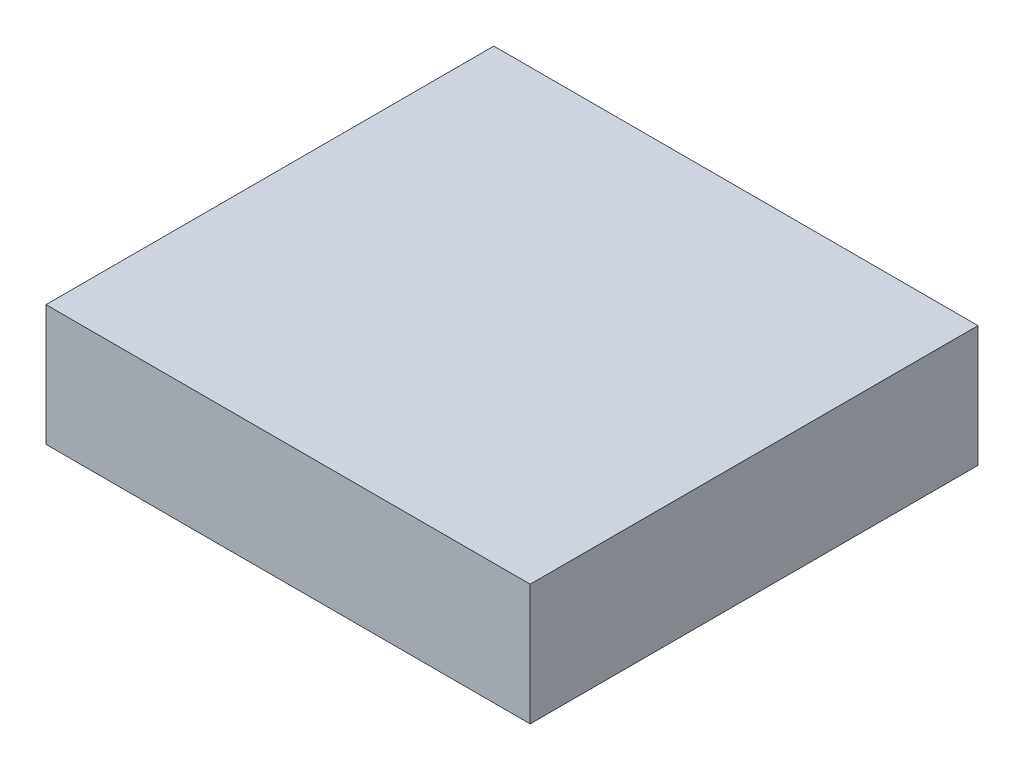
ISO-10303-21;
HEADER;
FILE_DESCRIPTION(('STEP AP214'),'2;1');
FILE_NAME('part.step','',(''),(''),'','','');
FILE_SCHEMA(('AUTOMOTIVE_DESIGN { 1 0 10303 214 1 1 1 1 }'));
ENDSEC;
DATA;
#1=APPLICATION_CONTEXT('core data for automotive mechanical design processes');
#2=APPLICATION_PROTOCOL_DEFINITION('international standard','automotive_design',2000,#1);
#3=PRODUCT_CONTEXT('',#1,'mechanical');
#4=PRODUCT('Part','Part','',(#3));
#5=PRODUCT_RELATED_PRODUCT_CATEGORY('part','',(#4));
#6=PRODUCT_DEFINITION_FORMATION('','',#4);
#7=PRODUCT_DEFINITION_CONTEXT('part definition',#1,'design');
#8=PRODUCT_DEFINITION('design','',#6,#7);
#9=PRODUCT_DEFINITION_SHAPE('','',#8);
#10=(LENGTH_UNIT() NAMED_UNIT(*) SI_UNIT(.MILLI.,.METRE.));
#11=(NAMED_UNIT(*) PLANE_ANGLE_UNIT() SI_UNIT($,.RADIAN.));
#12=(NAMED_UNIT(*) SI_UNIT($,.STERADIAN.) SOLID_ANGLE_UNIT());
#13=UNCERTAINTY_MEASURE_WITH_UNIT(LENGTH_MEASURE(1.E-05),#10,'distance_accuracy_value','');
#14=(GEOMETRIC_REPRESENTATION_CONTEXT(3) GLOBAL_UNCERTAINTY_ASSIGNED_CONTEXT((#13)) GLOBAL_UNIT_ASSIGNED_CONTEXT((#10,
#11,#12)) REPRESENTATION_CONTEXT('',''));
#15=CARTESIAN_POINT('',(0.,0.,0.));
#16=DIRECTION('',(0.,0.,1.));
#17=DIRECTION('',(1.,0.,0.));
#18=AXIS2_PLACEMENT_3D('',#15,#16,#17);
#19=CARTESIAN_POINT('',(0.,-10.,0.));
#20=DIRECTION('',(-1.,0.,0.));
#21=DIRECTION('',(0.,0.,1.));
#22=AXIS2_PLACEMENT_3D('',#19,#20,#21);
#23=PLANE('',#22);
#24=DIRECTION('',(0.,0.,1.));
#25=VECTOR('',#24,1.);
#26=CARTESIAN_POINT('',(0.,0.,0.));
#27=LINE('',#26,#25);
#28=CARTESIAN_POINT('',(0.,0.,-37.));
#29=VERTEX_POINT('',#28);
#30=CARTESIAN_POINT('',(0.,0.,0.));
#31=VERTEX_POINT('',#30);
#32=EDGE_CURVE('E104',#29,#31,#27,.T.);
#33=ORIENTED_EDGE('',*,*,#32,.F.);
#34=DIRECTION('',(0.,1.,0.));
#35=VECTOR('',#34,1.);
#36=CARTESIAN_POINT('',(0.,-10.,-37.));
#37=LINE('',#36,#35);
#38=CARTESIAN_POINT('',(0.,-10.,-37.));
#39=VERTEX_POINT('',#38);
#40=EDGE_CURVE('E11',#39,#29,#37,.T.);
#41=ORIENTED_EDGE('',*,*,#40,.F.);
#42=DIRECTION('',(0.,0.,1.));
#43=VECTOR('',#42,1.);
#44=CARTESIAN_POINT('',(0.,-10.,0.));
#45=LINE('',#44,#43);
#46=CARTESIAN_POINT('',(0.,-10.,0.));
#47=VERTEX_POINT('',#46);
#48=EDGE_CURVE('E100',#39,#47,#45,.T.);
#49=ORIENTED_EDGE('',*,*,#48,.T.);
#50=DIRECTION('',(0.,1.,0.));
#51=VECTOR('',#50,1.);
#52=CARTESIAN_POINT('',(0.,-10.,0.));
#53=LINE('',#52,#51);
#54=EDGE_CURVE('E45',#47,#31,#53,.T.);
#55=ORIENTED_EDGE('',*,*,#54,.T.);
#56=EDGE_LOOP('',(#33,#41,#49,#55));
#57=FACE_BOUND('',#56,.T.);
#58=ADVANCED_FACE('F39',(#57),#23,.T.);
#59=CARTESIAN_POINT('',(0.,-10.,-37.));
#60=DIRECTION('',(0.,0.,-1.));
#61=DIRECTION('',(-1.,0.,0.));
#62=AXIS2_PLACEMENT_3D('',#59,#60,#61);
#63=PLANE('',#62);
#64=DIRECTION('',(-1.,0.,0.));
#65=VECTOR('',#64,1.);
#66=CARTESIAN_POINT('',(0.,0.,-37.));
#67=LINE('',#66,#65);
#68=CARTESIAN_POINT('',(40.,0.,-37.));
#69=VERTEX_POINT('',#68);
#70=EDGE_CURVE('E98',#69,#29,#67,.T.);
#71=ORIENTED_EDGE('',*,*,#70,.F.);
#72=DIRECTION('',(0.,1.,0.));
#73=VECTOR('',#72,1.);
#74=CARTESIAN_POINT('',(40.,-10.,-37.));
#75=LINE('',#74,#73);
#76=CARTESIAN_POINT('',(40.,-10.,-37.));
#77=VERTEX_POINT('',#76);
#78=EDGE_CURVE('E48',#77,#69,#75,.T.);
#79=ORIENTED_EDGE('',*,*,#78,.F.);
#80=DIRECTION('',(-1.,0.,0.));
#81=VECTOR('',#80,1.);
#82=CARTESIAN_POINT('',(0.,-10.,-37.));
#83=LINE('',#82,#81);
#84=EDGE_CURVE('E92',#77,#39,#83,.T.);
#85=ORIENTED_EDGE('',*,*,#84,.T.);
#86=ORIENTED_EDGE('',*,*,#40,.T.);
#87=EDGE_LOOP('',(#71,#79,#85,#86));
#88=FACE_BOUND('',#87,.T.);
#89=ADVANCED_FACE('F111',(#88),#63,.T.);
#90=CARTESIAN_POINT('',(40.,-10.,0.));
#91=DIRECTION('',(1.,0.,0.));
#92=DIRECTION('',(0.,0.,-1.));
#93=AXIS2_PLACEMENT_3D('',#90,#91,#92);
#94=PLANE('',#93);
#95=DIRECTION('',(0.,0.,-1.));
#96=VECTOR('',#95,1.);
#97=CARTESIAN_POINT('',(40.,0.,0.));
#98=LINE('',#97,#96);
#99=CARTESIAN_POINT('',(40.,0.,0.));
#100=VERTEX_POINT('',#99);
#101=EDGE_CURVE('E87',#100,#69,#98,.T.);
#102=ORIENTED_EDGE('',*,*,#101,.F.);
#103=DIRECTION('',(0.,1.,0.));
#104=VECTOR('',#103,1.);
#105=CARTESIAN_POINT('',(40.,-10.,0.));
#106=LINE('',#105,#104);
#107=CARTESIAN_POINT('',(40.,-10.,0.));
#108=VERTEX_POINT('',#107);
#109=EDGE_CURVE('E84',#108,#100,#106,.T.);
#110=ORIENTED_EDGE('',*,*,#109,.F.);
#111=DIRECTION('',(0.,0.,-1.));
#112=VECTOR('',#111,1.);
#113=CARTESIAN_POINT('',(40.,-10.,0.));
#114=LINE('',#113,#112);
#115=EDGE_CURVE('E90',#108,#77,#114,.T.);
#116=ORIENTED_EDGE('',*,*,#115,.T.);
#117=ORIENTED_EDGE('',*,*,#78,.T.);
#118=EDGE_LOOP('',(#102,#110,#116,#117));
#119=FACE_BOUND('',#118,.T.);
#120=ADVANCED_FACE('F86',(#119),#94,.T.);
#121=CARTESIAN_POINT('',(0.,-10.,0.));
#122=DIRECTION('',(0.,0.,1.));
#123=DIRECTION('',(1.,0.,0.));
#124=AXIS2_PLACEMENT_3D('',#121,#122,#123);
#125=PLANE('',#124);
#126=DIRECTION('',(1.,0.,0.));
#127=VECTOR('',#126,1.);
#128=CARTESIAN_POINT('',(0.,0.,0.));
#129=LINE('',#128,#127);
#130=EDGE_CURVE('E106',#31,#100,#129,.T.);
#131=ORIENTED_EDGE('',*,*,#130,.F.);
#132=ORIENTED_EDGE('',*,*,#54,.F.);
#133=DIRECTION('',(1.,0.,0.));
#134=VECTOR('',#133,1.);
#135=CARTESIAN_POINT('',(0.,-10.,0.));
#136=LINE('',#135,#134);
#137=EDGE_CURVE('E93',#47,#108,#136,.T.);
#138=ORIENTED_EDGE('',*,*,#137,.T.);
#139=ORIENTED_EDGE('',*,*,#109,.T.);
#140=EDGE_LOOP('',(#131,#132,#138,#139));
#141=FACE_BOUND('',#140,.T.);
#142=ADVANCED_FACE('F96',(#141),#125,.T.);
#143=CARTESIAN_POINT('',(0.,-10.,0.));
#144=DIRECTION('',(0.,-1.,0.));
#145=DIRECTION('',(0.,0.,-1.));
#146=AXIS2_PLACEMENT_3D('',#143,#144,#145);
#147=PLANE('',#146);
#148=ORIENTED_EDGE('',*,*,#48,.F.);
#149=ORIENTED_EDGE('',*,*,#84,.F.);
#150=ORIENTED_EDGE('',*,*,#115,.F.);
#151=ORIENTED_EDGE('',*,*,#137,.F.);
#152=EDGE_LOOP('',(#148,#149,#150,#151));
#153=FACE_BOUND('',#152,.T.);
#154=ADVANCED_FACE('F95',(#153),#147,.T.);
#155=CARTESIAN_POINT('',(0.,0.,0.));
#156=DIRECTION('',(0.,-1.,0.));
#157=DIRECTION('',(0.,0.,-1.));
#158=AXIS2_PLACEMENT_3D('',#155,#156,#157);
#159=PLANE('',#158);
#160=ORIENTED_EDGE('',*,*,#32,.T.);
#161=ORIENTED_EDGE('',*,*,#130,.T.);
#162=ORIENTED_EDGE('',*,*,#101,.T.);
#163=ORIENTED_EDGE('',*,*,#70,.T.);
#164=EDGE_LOOP('',(#160,#161,#162,#163));
#165=FACE_BOUND('',#164,.T.);
#166=ADVANCED_FACE('F115',(#165),#159,.F.);
#167=CLOSED_SHELL('',(#58,#89,#120,#142,#154,#166));
#168=MANIFOLD_SOLID_BREP('B2',#167);
#169=ADVANCED_BREP_SHAPE_REPRESENTATION('',(#18,#168),#14);
#170=SHAPE_DEFINITION_REPRESENTATION(#9,#169);
ENDSEC;
END-ISO-10303-21;
